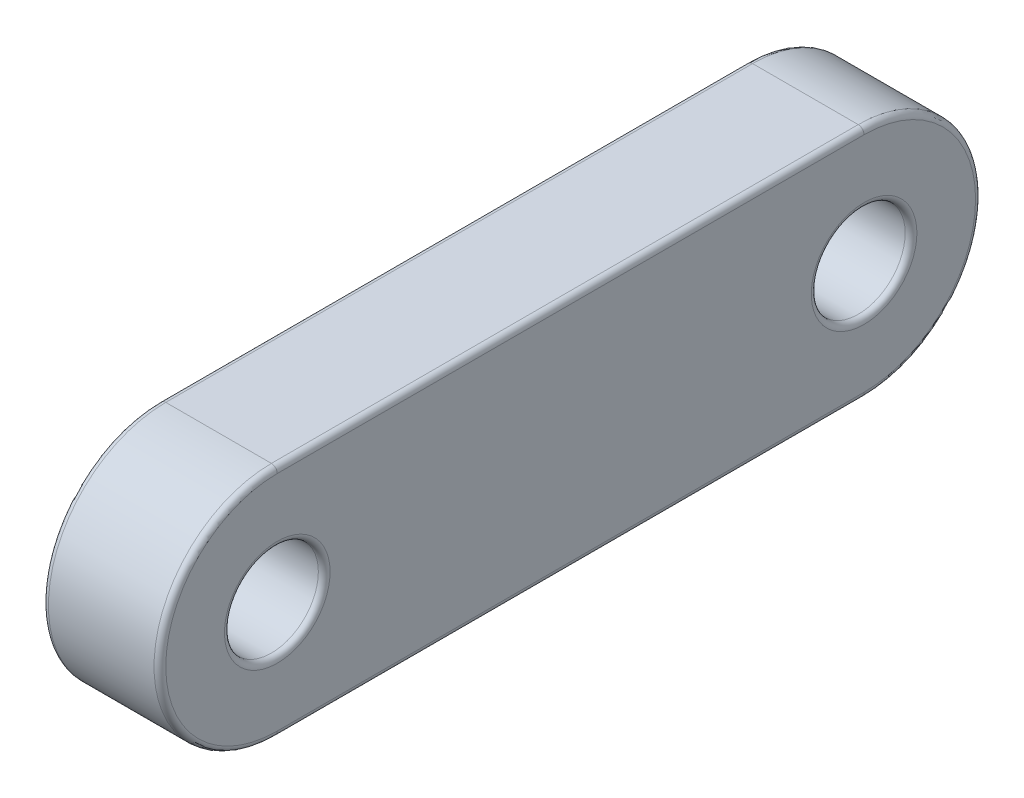
ISO-10303-21;
HEADER;
FILE_DESCRIPTION(('STEP AP214'),'2;1');
FILE_NAME('part.step','',(''),(''),'','','');
FILE_SCHEMA(('AUTOMOTIVE_DESIGN { 1 0 10303 214 1 1 1 1 }'));
ENDSEC;
DATA;
#1=APPLICATION_CONTEXT('core data for automotive mechanical design processes');
#2=APPLICATION_PROTOCOL_DEFINITION('international standard','automotive_design',2000,#1);
#3=PRODUCT_CONTEXT('',#1,'mechanical');
#4=PRODUCT('Part','Part','',(#3));
#5=PRODUCT_RELATED_PRODUCT_CATEGORY('part','',(#4));
#6=PRODUCT_DEFINITION_FORMATION('','',#4);
#7=PRODUCT_DEFINITION_CONTEXT('part definition',#1,'design');
#8=PRODUCT_DEFINITION('design','',#6,#7);
#9=PRODUCT_DEFINITION_SHAPE('','',#8);
#10=(LENGTH_UNIT() NAMED_UNIT(*) SI_UNIT(.MILLI.,.METRE.));
#11=(NAMED_UNIT(*) PLANE_ANGLE_UNIT() SI_UNIT($,.RADIAN.));
#12=(NAMED_UNIT(*) SI_UNIT($,.STERADIAN.) SOLID_ANGLE_UNIT());
#13=UNCERTAINTY_MEASURE_WITH_UNIT(LENGTH_MEASURE(1.E-05),#10,'distance_accuracy_value','');
#14=(GEOMETRIC_REPRESENTATION_CONTEXT(3) GLOBAL_UNCERTAINTY_ASSIGNED_CONTEXT((#13)) GLOBAL_UNIT_ASSIGNED_CONTEXT((#10,
#11,#12)) REPRESENTATION_CONTEXT('',''));
#15=CARTESIAN_POINT('',(0.,0.,0.));
#16=DIRECTION('',(0.,0.,1.));
#17=DIRECTION('',(1.,0.,0.));
#18=AXIS2_PLACEMENT_3D('',#15,#16,#17);
#19=CARTESIAN_POINT('',(5.,0.,0.));
#20=DIRECTION('',(1.,0.,0.));
#21=DIRECTION('',(0.,0.,-1.));
#22=AXIS2_PLACEMENT_3D('',#19,#20,#21);
#23=PLANE('',#22);
#24=CARTESIAN_POINT('',(5.,0.,-50.));
#25=DIRECTION('',(1.,0.,0.));
#26=DIRECTION('',(0.,0.,-1.));
#27=AXIS2_PLACEMENT_3D('',#24,#25,#26);
#28=CIRCLE('',#27,4.50000000000001);
#29=CARTESIAN_POINT('',(5.,0.,-54.5));
#30=VERTEX_POINT('',#29);
#31=EDGE_CURVE('E11',#30,#30,#28,.F.);
#32=ORIENTED_EDGE('',*,*,#31,.T.);
#33=EDGE_LOOP('',(#32));
#34=FACE_BOUND('',#33,.T.);
#35=CARTESIAN_POINT('',(5.,0.,-50.));
#36=DIRECTION('',(1.,0.,0.));
#37=DIRECTION('',(0.,0.,-1.));
#38=AXIS2_PLACEMENT_3D('',#35,#36,#37);
#39=CIRCLE('',#38,9.5);
#40=CARTESIAN_POINT('',(5.,-9.5,-50.));
#41=VERTEX_POINT('',#40);
#42=CARTESIAN_POINT('',(5.,9.5,-50.));
#43=VERTEX_POINT('',#42);
#44=EDGE_CURVE('E58',#41,#43,#39,.T.);
#45=ORIENTED_EDGE('',*,*,#44,.T.);
#46=DIRECTION('',(0.,0.,1.));
#47=VECTOR('',#46,1.);
#48=CARTESIAN_POINT('',(5.,9.5,0.));
#49=LINE('',#48,#47);
#50=CARTESIAN_POINT('',(5.,9.5,0.));
#51=VERTEX_POINT('',#50);
#52=EDGE_CURVE('E50',#43,#51,#49,.T.);
#53=ORIENTED_EDGE('',*,*,#52,.T.);
#54=CARTESIAN_POINT('',(5.,0.,0.));
#55=DIRECTION('',(1.,0.,0.));
#56=DIRECTION('',(0.,0.,-1.));
#57=AXIS2_PLACEMENT_3D('',#54,#55,#56);
#58=CIRCLE('',#57,9.5);
#59=CARTESIAN_POINT('',(5.,-9.5,0.));
#60=VERTEX_POINT('',#59);
#61=EDGE_CURVE('E176',#51,#60,#58,.T.);
#62=ORIENTED_EDGE('',*,*,#61,.T.);
#63=DIRECTION('',(0.,0.,-1.));
#64=VECTOR('',#63,1.);
#65=CARTESIAN_POINT('',(5.,-9.5,-50.));
#66=LINE('',#65,#64);
#67=EDGE_CURVE('E63',#60,#41,#66,.T.);
#68=ORIENTED_EDGE('',*,*,#67,.T.);
#69=EDGE_LOOP('',(#45,#53,#62,#68));
#70=FACE_BOUND('',#69,.T.);
#71=CARTESIAN_POINT('',(5.,0.,0.));
#72=DIRECTION('',(1.,0.,0.));
#73=DIRECTION('',(0.,0.,-1.));
#74=AXIS2_PLACEMENT_3D('',#71,#72,#73);
#75=CIRCLE('',#74,4.5);
#76=CARTESIAN_POINT('',(5.,0.,-4.5));
#77=VERTEX_POINT('',#76);
#78=EDGE_CURVE('E173',#77,#77,#75,.F.);
#79=ORIENTED_EDGE('',*,*,#78,.T.);
#80=EDGE_LOOP('',(#79));
#81=FACE_BOUND('',#80,.T.);
#82=ADVANCED_FACE('F41',(#34,#70,#81),#23,.T.);
#83=CARTESIAN_POINT('',(-5.,0.,0.));
#84=DIRECTION('',(1.,0.,0.));
#85=DIRECTION('',(0.,0.,-1.));
#86=AXIS2_PLACEMENT_3D('',#83,#84,#85);
#87=PLANE('',#86);
#88=CARTESIAN_POINT('',(-5.,0.,-50.));
#89=DIRECTION('',(1.,0.,0.));
#90=DIRECTION('',(0.,0.,-1.));
#91=AXIS2_PLACEMENT_3D('',#88,#89,#90);
#92=CIRCLE('',#91,4.50000000000001);
#93=CARTESIAN_POINT('',(-5.,0.,-54.5));
#94=VERTEX_POINT('',#93);
#95=EDGE_CURVE('E138',#94,#94,#92,.T.);
#96=ORIENTED_EDGE('',*,*,#95,.T.);
#97=EDGE_LOOP('',(#96));
#98=FACE_BOUND('',#97,.T.);
#99=CARTESIAN_POINT('',(-5.,0.,0.));
#100=DIRECTION('',(1.,0.,0.));
#101=DIRECTION('',(0.,0.,-1.));
#102=AXIS2_PLACEMENT_3D('',#99,#100,#101);
#103=CIRCLE('',#102,4.5);
#104=CARTESIAN_POINT('',(-5.,0.,-4.5));
#105=VERTEX_POINT('',#104);
#106=EDGE_CURVE('E135',#105,#105,#103,.T.);
#107=ORIENTED_EDGE('',*,*,#106,.T.);
#108=EDGE_LOOP('',(#107));
#109=FACE_BOUND('',#108,.T.);
#110=CARTESIAN_POINT('',(-5.,0.,-50.));
#111=DIRECTION('',(1.,0.,0.));
#112=DIRECTION('',(0.,0.,-1.));
#113=AXIS2_PLACEMENT_3D('',#110,#111,#112);
#114=CIRCLE('',#113,9.5);
#115=CARTESIAN_POINT('',(-5.,9.5,-50.));
#116=VERTEX_POINT('',#115);
#117=CARTESIAN_POINT('',(-5.,-9.5,-50.));
#118=VERTEX_POINT('',#117);
#119=EDGE_CURVE('E134',#116,#118,#114,.F.);
#120=ORIENTED_EDGE('',*,*,#119,.T.);
#121=DIRECTION('',(0.,0.,-1.));
#122=VECTOR('',#121,1.);
#123=CARTESIAN_POINT('',(-5.,-9.5,0.));
#124=LINE('',#123,#122);
#125=CARTESIAN_POINT('',(-5.,-9.5,0.));
#126=VERTEX_POINT('',#125);
#127=EDGE_CURVE('E113',#118,#126,#124,.F.);
#128=ORIENTED_EDGE('',*,*,#127,.T.);
#129=CARTESIAN_POINT('',(-5.,0.,0.));
#130=DIRECTION('',(1.,0.,0.));
#131=DIRECTION('',(0.,0.,-1.));
#132=AXIS2_PLACEMENT_3D('',#129,#130,#131);
#133=CIRCLE('',#132,9.5);
#134=CARTESIAN_POINT('',(-5.,9.5,0.));
#135=VERTEX_POINT('',#134);
#136=EDGE_CURVE('E123',#126,#135,#133,.F.);
#137=ORIENTED_EDGE('',*,*,#136,.T.);
#138=DIRECTION('',(0.,0.,1.));
#139=VECTOR('',#138,1.);
#140=CARTESIAN_POINT('',(-5.,9.5,0.));
#141=LINE('',#140,#139);
#142=EDGE_CURVE('E129',#135,#116,#141,.F.);
#143=ORIENTED_EDGE('',*,*,#142,.T.);
#144=EDGE_LOOP('',(#120,#128,#137,#143));
#145=FACE_BOUND('',#144,.T.);
#146=ADVANCED_FACE('F132',(#98,#109,#145),#87,.F.);
#147=CARTESIAN_POINT('',(5.,0.,0.));
#148=DIRECTION('',(-1.,0.,0.));
#149=DIRECTION('',(0.,0.,1.));
#150=AXIS2_PLACEMENT_3D('',#147,#148,#149);
#151=CYLINDRICAL_SURFACE('',#150,10.);
#152=DIRECTION('',(-1.,0.,0.));
#153=VECTOR('',#152,1.);
#154=CARTESIAN_POINT('',(5.,10.,0.));
#155=LINE('',#154,#153);
#156=CARTESIAN_POINT('',(4.5,10.,0.));
#157=VERTEX_POINT('',#156);
#158=CARTESIAN_POINT('',(-4.5,10.,0.));
#159=VERTEX_POINT('',#158);
#160=EDGE_CURVE('E185',#157,#159,#155,.T.);
#161=ORIENTED_EDGE('',*,*,#160,.T.);
#162=CARTESIAN_POINT('',(-4.5,0.,0.));
#163=DIRECTION('',(1.,0.,0.));
#164=DIRECTION('',(0.,0.,-1.));
#165=AXIS2_PLACEMENT_3D('',#162,#163,#164);
#166=CIRCLE('',#165,10.);
#167=CARTESIAN_POINT('',(-4.5,-10.,0.));
#168=VERTEX_POINT('',#167);
#169=EDGE_CURVE('E171',#159,#168,#166,.T.);
#170=ORIENTED_EDGE('',*,*,#169,.T.);
#171=DIRECTION('',(-1.,0.,0.));
#172=VECTOR('',#171,1.);
#173=CARTESIAN_POINT('',(5.,-10.,0.));
#174=LINE('',#173,#172);
#175=CARTESIAN_POINT('',(4.5,-10.,0.));
#176=VERTEX_POINT('',#175);
#177=EDGE_CURVE('E130',#176,#168,#174,.T.);
#178=ORIENTED_EDGE('',*,*,#177,.F.);
#179=CARTESIAN_POINT('',(4.5,0.,0.));
#180=DIRECTION('',(1.,0.,0.));
#181=DIRECTION('',(0.,0.,-1.));
#182=AXIS2_PLACEMENT_3D('',#179,#180,#181);
#183=CIRCLE('',#182,10.);
#184=EDGE_CURVE('E169',#176,#157,#183,.F.);
#185=ORIENTED_EDGE('',*,*,#184,.T.);
#186=EDGE_LOOP('',(#161,#170,#178,#185));
#187=FACE_BOUND('',#186,.T.);
#188=ADVANCED_FACE('F211',(#187),#151,.T.);
#189=CARTESIAN_POINT('',(5.,-10.,0.));
#190=DIRECTION('',(0.,1.,0.));
#191=DIRECTION('',(0.,0.,1.));
#192=AXIS2_PLACEMENT_3D('',#189,#190,#191);
#193=PLANE('',#192);
#194=ORIENTED_EDGE('',*,*,#177,.T.);
#195=DIRECTION('',(0.,0.,-1.));
#196=VECTOR('',#195,1.);
#197=CARTESIAN_POINT('',(-4.5,-10.,0.));
#198=LINE('',#197,#196);
#199=CARTESIAN_POINT('',(-4.5,-10.,-50.));
#200=VERTEX_POINT('',#199);
#201=EDGE_CURVE('E116',#168,#200,#198,.T.);
#202=ORIENTED_EDGE('',*,*,#201,.T.);
#203=DIRECTION('',(-1.,0.,0.));
#204=VECTOR('',#203,1.);
#205=CARTESIAN_POINT('',(5.,-10.,-50.));
#206=LINE('',#205,#204);
#207=CARTESIAN_POINT('',(4.5,-10.,-50.));
#208=VERTEX_POINT('',#207);
#209=EDGE_CURVE('E208',#208,#200,#206,.T.);
#210=ORIENTED_EDGE('',*,*,#209,.F.);
#211=DIRECTION('',(0.,0.,-1.));
#212=VECTOR('',#211,1.);
#213=CARTESIAN_POINT('',(4.5,-10.,0.));
#214=LINE('',#213,#212);
#215=EDGE_CURVE('E157',#208,#176,#214,.F.);
#216=ORIENTED_EDGE('',*,*,#215,.T.);
#217=EDGE_LOOP('',(#194,#202,#210,#216));
#218=FACE_BOUND('',#217,.T.);
#219=ADVANCED_FACE('F206',(#218),#193,.F.);
#220=CARTESIAN_POINT('',(5.,0.,-50.));
#221=DIRECTION('',(-1.,0.,0.));
#222=DIRECTION('',(0.,0.,1.));
#223=AXIS2_PLACEMENT_3D('',#220,#221,#222);
#224=CYLINDRICAL_SURFACE('',#223,10.);
#225=ORIENTED_EDGE('',*,*,#209,.T.);
#226=CARTESIAN_POINT('',(-4.5,0.,-50.));
#227=DIRECTION('',(1.,0.,0.));
#228=DIRECTION('',(0.,0.,-1.));
#229=AXIS2_PLACEMENT_3D('',#226,#227,#228);
#230=CIRCLE('',#229,10.);
#231=CARTESIAN_POINT('',(-4.5,10.,-50.));
#232=VERTEX_POINT('',#231);
#233=EDGE_CURVE('E162',#200,#232,#230,.T.);
#234=ORIENTED_EDGE('',*,*,#233,.T.);
#235=DIRECTION('',(-1.,0.,0.));
#236=VECTOR('',#235,1.);
#237=CARTESIAN_POINT('',(5.,10.,-50.));
#238=LINE('',#237,#236);
#239=CARTESIAN_POINT('',(4.5,10.,-50.));
#240=VERTEX_POINT('',#239);
#241=EDGE_CURVE('E214',#240,#232,#238,.T.);
#242=ORIENTED_EDGE('',*,*,#241,.F.);
#243=CARTESIAN_POINT('',(4.5,0.,-50.));
#244=DIRECTION('',(1.,0.,0.));
#245=DIRECTION('',(0.,0.,-1.));
#246=AXIS2_PLACEMENT_3D('',#243,#244,#245);
#247=CIRCLE('',#246,10.);
#248=EDGE_CURVE('E160',#240,#208,#247,.F.);
#249=ORIENTED_EDGE('',*,*,#248,.T.);
#250=EDGE_LOOP('',(#225,#234,#242,#249));
#251=FACE_BOUND('',#250,.T.);
#252=ADVANCED_FACE('F227',(#251),#224,.T.);
#253=CARTESIAN_POINT('',(5.,10.,0.));
#254=DIRECTION('',(0.,-1.,0.));
#255=DIRECTION('',(0.,0.,-1.));
#256=AXIS2_PLACEMENT_3D('',#253,#254,#255);
#257=PLANE('',#256);
#258=ORIENTED_EDGE('',*,*,#241,.T.);
#259=DIRECTION('',(0.,0.,1.));
#260=VECTOR('',#259,1.);
#261=CARTESIAN_POINT('',(-4.5,10.,0.));
#262=LINE('',#261,#260);
#263=EDGE_CURVE('E167',#232,#159,#262,.T.);
#264=ORIENTED_EDGE('',*,*,#263,.T.);
#265=ORIENTED_EDGE('',*,*,#160,.F.);
#266=DIRECTION('',(0.,0.,1.));
#267=VECTOR('',#266,1.);
#268=CARTESIAN_POINT('',(4.5,10.,-50.));
#269=LINE('',#268,#267);
#270=EDGE_CURVE('E164',#157,#240,#269,.F.);
#271=ORIENTED_EDGE('',*,*,#270,.T.);
#272=EDGE_LOOP('',(#258,#264,#265,#271));
#273=FACE_BOUND('',#272,.T.);
#274=ADVANCED_FACE('F231',(#273),#257,.F.);
#275=CARTESIAN_POINT('',(5.,0.,0.));
#276=DIRECTION('',(-1.,0.,0.));
#277=DIRECTION('',(0.,0.,1.));
#278=AXIS2_PLACEMENT_3D('',#275,#276,#277);
#279=CYLINDRICAL_SURFACE('',#278,4.);
#280=CARTESIAN_POINT('',(-4.5,0.,0.));
#281=DIRECTION('',(1.,0.,0.));
#282=DIRECTION('',(0.,0.,-1.));
#283=AXIS2_PLACEMENT_3D('',#280,#281,#282);
#284=CIRCLE('',#283,4.);
#285=CARTESIAN_POINT('',(-4.5,0.,-4.));
#286=VERTEX_POINT('',#285);
#287=EDGE_CURVE('E154',#286,#286,#284,.F.);
#288=ORIENTED_EDGE('',*,*,#287,.T.);
#289=EDGE_LOOP('',(#288));
#290=FACE_BOUND('',#289,.T.);
#291=CARTESIAN_POINT('',(4.5,0.,0.));
#292=DIRECTION('',(1.,0.,0.));
#293=DIRECTION('',(0.,0.,-1.));
#294=AXIS2_PLACEMENT_3D('',#291,#292,#293);
#295=CIRCLE('',#294,4.);
#296=CARTESIAN_POINT('',(4.5,0.,-4.));
#297=VERTEX_POINT('',#296);
#298=EDGE_CURVE('E151',#297,#297,#295,.T.);
#299=ORIENTED_EDGE('',*,*,#298,.T.);
#300=EDGE_LOOP('',(#299));
#301=FACE_BOUND('',#300,.T.);
#302=ADVANCED_FACE('F247',(#290,#301),#279,.F.);
#303=CARTESIAN_POINT('',(5.,0.,-50.));
#304=DIRECTION('',(-1.,0.,0.));
#305=DIRECTION('',(0.,0.,1.));
#306=AXIS2_PLACEMENT_3D('',#303,#304,#305);
#307=CYLINDRICAL_SURFACE('',#306,4.00000000000001);
#308=CARTESIAN_POINT('',(-4.5,0.,-50.));
#309=DIRECTION('',(1.,0.,0.));
#310=DIRECTION('',(0.,0.,-1.));
#311=AXIS2_PLACEMENT_3D('',#308,#309,#310);
#312=CIRCLE('',#311,4.00000000000001);
#313=CARTESIAN_POINT('',(-4.5,0.,-54.));
#314=VERTEX_POINT('',#313);
#315=EDGE_CURVE('E148',#314,#314,#312,.F.);
#316=ORIENTED_EDGE('',*,*,#315,.T.);
#317=EDGE_LOOP('',(#316));
#318=FACE_BOUND('',#317,.T.);
#319=CARTESIAN_POINT('',(4.5,0.,-50.));
#320=DIRECTION('',(1.,0.,0.));
#321=DIRECTION('',(0.,0.,-1.));
#322=AXIS2_PLACEMENT_3D('',#319,#320,#321);
#323=CIRCLE('',#322,4.00000000000001);
#324=CARTESIAN_POINT('',(4.5,0.,-54.));
#325=VERTEX_POINT('',#324);
#326=EDGE_CURVE('E145',#325,#325,#323,.T.);
#327=ORIENTED_EDGE('',*,*,#326,.T.);
#328=EDGE_LOOP('',(#327));
#329=FACE_BOUND('',#328,.T.);
#330=ADVANCED_FACE('F249',(#318,#329),#307,.F.);
#331=CARTESIAN_POINT('',(-4.5,0.,-50.));
#332=DIRECTION('',(1.,0.,0.));
#333=DIRECTION('',(0.,0.,-1.));
#334=AXIS2_PLACEMENT_3D('',#331,#332,#333);
#335=TOROIDAL_SURFACE('',#334,4.50000000000001,0.5);
#336=ORIENTED_EDGE('',*,*,#315,.F.);
#337=EDGE_LOOP('',(#336));
#338=FACE_BOUND('',#337,.T.);
#339=ORIENTED_EDGE('',*,*,#95,.F.);
#340=EDGE_LOOP('',(#339));
#341=FACE_BOUND('',#340,.T.);
#342=ADVANCED_FACE('F256',(#338,#341),#335,.T.);
#343=CARTESIAN_POINT('',(-4.5,0.,0.));
#344=DIRECTION('',(1.,0.,0.));
#345=DIRECTION('',(0.,0.,-1.));
#346=AXIS2_PLACEMENT_3D('',#343,#344,#345);
#347=TOROIDAL_SURFACE('',#346,4.5,0.5);
#348=ORIENTED_EDGE('',*,*,#287,.F.);
#349=EDGE_LOOP('',(#348));
#350=FACE_BOUND('',#349,.T.);
#351=ORIENTED_EDGE('',*,*,#106,.F.);
#352=EDGE_LOOP('',(#351));
#353=FACE_BOUND('',#352,.T.);
#354=ADVANCED_FACE('F272',(#350,#353),#347,.T.);
#355=CARTESIAN_POINT('',(-4.5,9.5,0.));
#356=DIRECTION('',(0.,0.,1.));
#357=DIRECTION('',(1.,0.,0.));
#358=AXIS2_PLACEMENT_3D('',#355,#356,#357);
#359=CYLINDRICAL_SURFACE('',#358,0.5);
#360=CARTESIAN_POINT('',(-4.5,9.5,-50.));
#361=DIRECTION('',(0.,0.,-1.));
#362=DIRECTION('',(-1.,0.,0.));
#363=AXIS2_PLACEMENT_3D('',#360,#361,#362);
#364=CIRCLE('',#363,0.5);
#365=EDGE_CURVE('E119',#116,#232,#364,.T.);
#366=ORIENTED_EDGE('',*,*,#365,.F.);
#367=ORIENTED_EDGE('',*,*,#142,.F.);
#368=CARTESIAN_POINT('',(-4.5,9.5,0.));
#369=DIRECTION('',(0.,0.,1.));
#370=DIRECTION('',(1.,0.,0.));
#371=AXIS2_PLACEMENT_3D('',#368,#369,#370);
#372=CIRCLE('',#371,0.5);
#373=EDGE_CURVE('E126',#159,#135,#372,.T.);
#374=ORIENTED_EDGE('',*,*,#373,.F.);
#375=ORIENTED_EDGE('',*,*,#263,.F.);
#376=EDGE_LOOP('',(#366,#367,#374,#375));
#377=FACE_BOUND('',#376,.T.);
#378=ADVANCED_FACE('F220',(#377),#359,.T.);
#379=CARTESIAN_POINT('',(-4.5,0.,0.));
#380=DIRECTION('',(1.,0.,0.));
#381=DIRECTION('',(0.,0.,-1.));
#382=AXIS2_PLACEMENT_3D('',#379,#380,#381);
#383=TOROIDAL_SURFACE('',#382,9.5,0.5);
#384=ORIENTED_EDGE('',*,*,#373,.T.);
#385=ORIENTED_EDGE('',*,*,#136,.F.);
#386=CARTESIAN_POINT('',(-4.5,-9.5,0.));
#387=DIRECTION('',(0.,0.,-1.));
#388=DIRECTION('',(-1.,0.,0.));
#389=AXIS2_PLACEMENT_3D('',#386,#387,#388);
#390=CIRCLE('',#389,0.5);
#391=EDGE_CURVE('E109',#168,#126,#390,.T.);
#392=ORIENTED_EDGE('',*,*,#391,.F.);
#393=ORIENTED_EDGE('',*,*,#169,.F.);
#394=EDGE_LOOP('',(#384,#385,#392,#393));
#395=FACE_BOUND('',#394,.T.);
#396=ADVANCED_FACE('F124',(#395),#383,.T.);
#397=CARTESIAN_POINT('',(-4.5,0.,-50.));
#398=DIRECTION('',(1.,0.,0.));
#399=DIRECTION('',(0.,0.,-1.));
#400=AXIS2_PLACEMENT_3D('',#397,#398,#399);
#401=TOROIDAL_SURFACE('',#400,9.5,0.5);
#402=ORIENTED_EDGE('',*,*,#365,.T.);
#403=ORIENTED_EDGE('',*,*,#233,.F.);
#404=CARTESIAN_POINT('',(-4.5,-9.5,-50.));
#405=DIRECTION('',(0.,0.,1.));
#406=DIRECTION('',(1.,0.,0.));
#407=AXIS2_PLACEMENT_3D('',#404,#405,#406);
#408=CIRCLE('',#407,0.5);
#409=EDGE_CURVE('E120',#118,#200,#408,.T.);
#410=ORIENTED_EDGE('',*,*,#409,.F.);
#411=ORIENTED_EDGE('',*,*,#119,.F.);
#412=EDGE_LOOP('',(#402,#403,#410,#411));
#413=FACE_BOUND('',#412,.T.);
#414=ADVANCED_FACE('F223',(#413),#401,.T.);
#415=CARTESIAN_POINT('',(-4.5,-9.5,0.));
#416=DIRECTION('',(0.,0.,-1.));
#417=DIRECTION('',(-1.,0.,0.));
#418=AXIS2_PLACEMENT_3D('',#415,#416,#417);
#419=CYLINDRICAL_SURFACE('',#418,0.5);
#420=ORIENTED_EDGE('',*,*,#391,.T.);
#421=ORIENTED_EDGE('',*,*,#127,.F.);
#422=ORIENTED_EDGE('',*,*,#409,.T.);
#423=ORIENTED_EDGE('',*,*,#201,.F.);
#424=EDGE_LOOP('',(#420,#421,#422,#423));
#425=FACE_BOUND('',#424,.T.);
#426=ADVANCED_FACE('F111',(#425),#419,.T.);
#427=CARTESIAN_POINT('',(4.5,0.,-50.));
#428=DIRECTION('',(1.,0.,0.));
#429=DIRECTION('',(0.,0.,-1.));
#430=AXIS2_PLACEMENT_3D('',#427,#428,#429);
#431=TOROIDAL_SURFACE('',#430,4.50000000000001,0.5);
#432=ORIENTED_EDGE('',*,*,#31,.F.);
#433=EDGE_LOOP('',(#432));
#434=FACE_BOUND('',#433,.T.);
#435=ORIENTED_EDGE('',*,*,#326,.F.);
#436=EDGE_LOOP('',(#435));
#437=FACE_BOUND('',#436,.T.);
#438=ADVANCED_FACE('F279',(#434,#437),#431,.T.);
#439=CARTESIAN_POINT('',(4.5,-9.5,0.));
#440=DIRECTION('',(0.,0.,1.));
#441=DIRECTION('',(1.,0.,0.));
#442=AXIS2_PLACEMENT_3D('',#439,#440,#441);
#443=CYLINDRICAL_SURFACE('',#442,0.5);
#444=CARTESIAN_POINT('',(4.5,-9.5,0.));
#445=DIRECTION('',(0.,0.,1.));
#446=DIRECTION('',(1.,0.,0.));
#447=AXIS2_PLACEMENT_3D('',#444,#445,#446);
#448=CIRCLE('',#447,0.5);
#449=EDGE_CURVE('E189',#176,#60,#448,.T.);
#450=ORIENTED_EDGE('',*,*,#449,.F.);
#451=ORIENTED_EDGE('',*,*,#215,.F.);
#452=CARTESIAN_POINT('',(4.5,-9.5,-50.));
#453=DIRECTION('',(0.,0.,-1.));
#454=DIRECTION('',(-1.,0.,0.));
#455=AXIS2_PLACEMENT_3D('',#452,#453,#454);
#456=CIRCLE('',#455,0.5);
#457=EDGE_CURVE('E45',#41,#208,#456,.T.);
#458=ORIENTED_EDGE('',*,*,#457,.F.);
#459=ORIENTED_EDGE('',*,*,#67,.F.);
#460=EDGE_LOOP('',(#450,#451,#458,#459));
#461=FACE_BOUND('',#460,.T.);
#462=ADVANCED_FACE('F201',(#461),#443,.T.);
#463=CARTESIAN_POINT('',(4.5,0.,-50.));
#464=DIRECTION('',(1.,0.,0.));
#465=DIRECTION('',(0.,0.,-1.));
#466=AXIS2_PLACEMENT_3D('',#463,#464,#465);
#467=TOROIDAL_SURFACE('',#466,9.5,0.5);
#468=ORIENTED_EDGE('',*,*,#457,.T.);
#469=ORIENTED_EDGE('',*,*,#248,.F.);
#470=CARTESIAN_POINT('',(4.5,9.5,-50.));
#471=DIRECTION('',(0.,0.,1.));
#472=DIRECTION('',(1.,0.,0.));
#473=AXIS2_PLACEMENT_3D('',#470,#471,#472);
#474=CIRCLE('',#473,0.5);
#475=EDGE_CURVE('E188',#43,#240,#474,.T.);
#476=ORIENTED_EDGE('',*,*,#475,.F.);
#477=ORIENTED_EDGE('',*,*,#44,.F.);
#478=EDGE_LOOP('',(#468,#469,#476,#477));
#479=FACE_BOUND('',#478,.T.);
#480=ADVANCED_FACE('F198',(#479),#467,.T.);
#481=CARTESIAN_POINT('',(4.5,0.,0.));
#482=DIRECTION('',(1.,0.,0.));
#483=DIRECTION('',(0.,0.,-1.));
#484=AXIS2_PLACEMENT_3D('',#481,#482,#483);
#485=TOROIDAL_SURFACE('',#484,9.5,0.5);
#486=ORIENTED_EDGE('',*,*,#449,.T.);
#487=ORIENTED_EDGE('',*,*,#61,.F.);
#488=CARTESIAN_POINT('',(4.5,9.5,0.));
#489=DIRECTION('',(0.,0.,-1.));
#490=DIRECTION('',(-1.,0.,0.));
#491=AXIS2_PLACEMENT_3D('',#488,#489,#490);
#492=CIRCLE('',#491,0.5);
#493=EDGE_CURVE('E186',#157,#51,#492,.T.);
#494=ORIENTED_EDGE('',*,*,#493,.F.);
#495=ORIENTED_EDGE('',*,*,#184,.F.);
#496=EDGE_LOOP('',(#486,#487,#494,#495));
#497=FACE_BOUND('',#496,.T.);
#498=ADVANCED_FACE('F236',(#497),#485,.T.);
#499=CARTESIAN_POINT('',(4.5,9.5,0.));
#500=DIRECTION('',(0.,0.,-1.));
#501=DIRECTION('',(-1.,0.,0.));
#502=AXIS2_PLACEMENT_3D('',#499,#500,#501);
#503=CYLINDRICAL_SURFACE('',#502,0.5);
#504=ORIENTED_EDGE('',*,*,#475,.T.);
#505=ORIENTED_EDGE('',*,*,#270,.F.);
#506=ORIENTED_EDGE('',*,*,#493,.T.);
#507=ORIENTED_EDGE('',*,*,#52,.F.);
#508=EDGE_LOOP('',(#504,#505,#506,#507));
#509=FACE_BOUND('',#508,.T.);
#510=ADVANCED_FACE('F234',(#509),#503,.T.);
#511=CARTESIAN_POINT('',(4.5,0.,0.));
#512=DIRECTION('',(1.,0.,0.));
#513=DIRECTION('',(0.,0.,-1.));
#514=AXIS2_PLACEMENT_3D('',#511,#512,#513);
#515=TOROIDAL_SURFACE('',#514,4.5,0.5);
#516=ORIENTED_EDGE('',*,*,#78,.F.);
#517=EDGE_LOOP('',(#516));
#518=FACE_BOUND('',#517,.T.);
#519=ORIENTED_EDGE('',*,*,#298,.F.);
#520=EDGE_LOOP('',(#519));
#521=FACE_BOUND('',#520,.T.);
#522=ADVANCED_FACE('F43',(#518,#521),#515,.T.);
#523=CLOSED_SHELL('',(#82,#146,#188,#219,#252,#274,#302,#330,#342,#354,#378,#396,#414,#426,#438,
#462,#480,#498,#510,#522));
#524=MANIFOLD_SOLID_BREP('B2',#523);
#525=ADVANCED_BREP_SHAPE_REPRESENTATION('',(#18,#524),#14);
#526=SHAPE_DEFINITION_REPRESENTATION(#9,#525);
ENDSEC;
END-ISO-10303-21;
